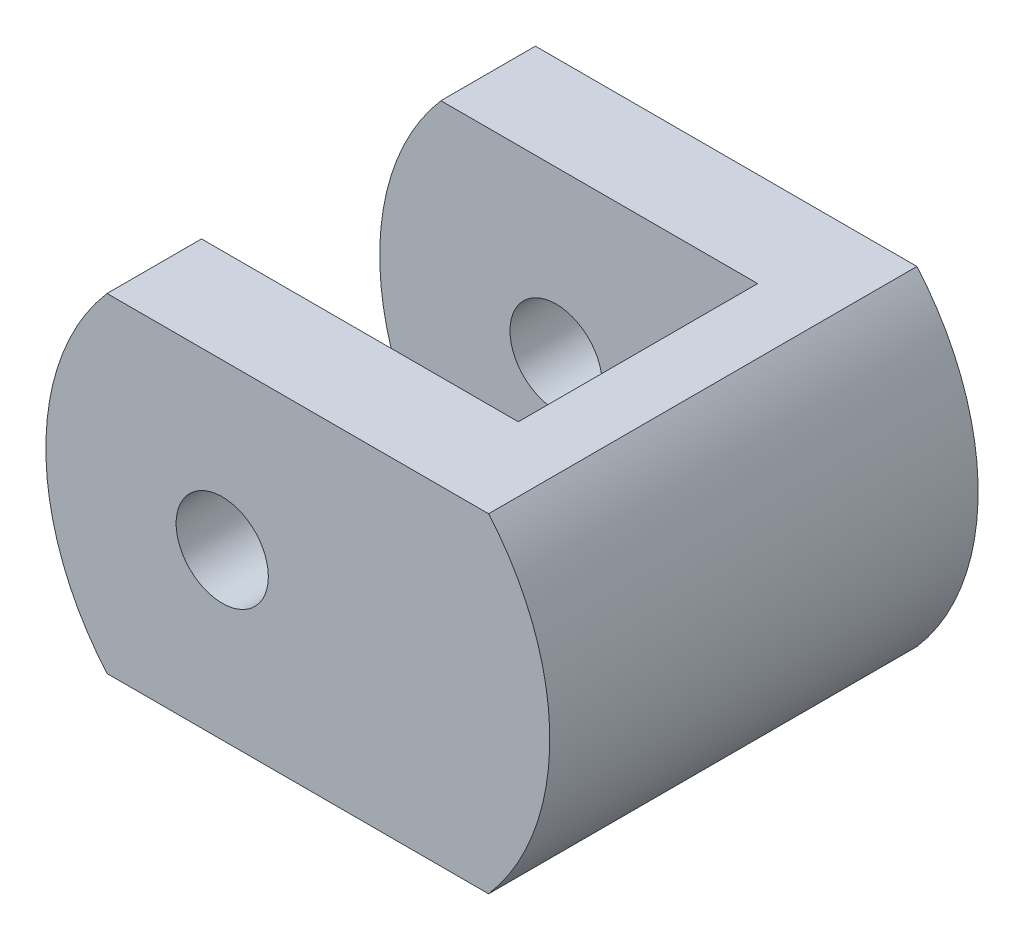
ISO-10303-21;
HEADER;
FILE_DESCRIPTION(('STEP AP214'),'2;1');
FILE_NAME('part.step','',(''),(''),'','','');
FILE_SCHEMA(('AUTOMOTIVE_DESIGN { 1 0 10303 214 1 1 1 1 }'));
ENDSEC;
DATA;
#1=APPLICATION_CONTEXT('core data for automotive mechanical design processes');
#2=APPLICATION_PROTOCOL_DEFINITION('international standard','automotive_design',2000,#1);
#3=PRODUCT_CONTEXT('',#1,'mechanical');
#4=PRODUCT('Part','Part','',(#3));
#5=PRODUCT_RELATED_PRODUCT_CATEGORY('part','',(#4));
#6=PRODUCT_DEFINITION_FORMATION('','',#4);
#7=PRODUCT_DEFINITION_CONTEXT('part definition',#1,'design');
#8=PRODUCT_DEFINITION('design','',#6,#7);
#9=PRODUCT_DEFINITION_SHAPE('','',#8);
#10=(LENGTH_UNIT() NAMED_UNIT(*) SI_UNIT(.MILLI.,.METRE.));
#11=(NAMED_UNIT(*) PLANE_ANGLE_UNIT() SI_UNIT($,.RADIAN.));
#12=(NAMED_UNIT(*) SI_UNIT($,.STERADIAN.) SOLID_ANGLE_UNIT());
#13=UNCERTAINTY_MEASURE_WITH_UNIT(LENGTH_MEASURE(1.E-05),#10,'distance_accuracy_value','');
#14=(GEOMETRIC_REPRESENTATION_CONTEXT(3) GLOBAL_UNCERTAINTY_ASSIGNED_CONTEXT((#13)) GLOBAL_UNIT_ASSIGNED_CONTEXT((#10,
#11,#12)) REPRESENTATION_CONTEXT('',''));
#15=CARTESIAN_POINT('',(0.,0.,0.));
#16=DIRECTION('',(0.,0.,1.));
#17=DIRECTION('',(1.,0.,0.));
#18=AXIS2_PLACEMENT_3D('',#15,#16,#17);
#19=CARTESIAN_POINT('',(0.,0.,10.795));
#20=DIRECTION('',(0.,0.,1.));
#21=DIRECTION('',(1.,0.,0.));
#22=AXIS2_PLACEMENT_3D('',#19,#20,#21);
#23=CYLINDRICAL_SURFACE('',#22,12.7);
#24=DIRECTION('',(0.,0.,1.));
#25=VECTOR('',#24,1.);
#26=CARTESIAN_POINT('',(9.61580905389342,8.29615671495309,-10.795));
#27=LINE('',#26,#25);
#28=CARTESIAN_POINT('',(9.61580905389342,8.29615671495309,-10.795));
#29=VERTEX_POINT('',#28);
#30=CARTESIAN_POINT('',(9.61580905389342,8.29615671495309,10.795));
#31=VERTEX_POINT('',#30);
#32=EDGE_CURVE('E150',#29,#31,#27,.T.);
#33=ORIENTED_EDGE('',*,*,#32,.T.);
#34=CARTESIAN_POINT('',(0.,0.,10.795));
#35=DIRECTION('',(0.,0.,1.));
#36=DIRECTION('',(1.,0.,0.));
#37=AXIS2_PLACEMENT_3D('',#34,#35,#36);
#38=CIRCLE('',#37,12.7);
#39=CARTESIAN_POINT('',(9.61580905389342,-8.29615671495309,10.795));
#40=VERTEX_POINT('',#39);
#41=EDGE_CURVE('E121',#40,#31,#38,.T.);
#42=ORIENTED_EDGE('',*,*,#41,.F.);
#43=DIRECTION('',(0.,0.,1.));
#44=VECTOR('',#43,1.);
#45=CARTESIAN_POINT('',(9.61580905389342,-8.29615671495309,-10.795));
#46=LINE('',#45,#44);
#47=CARTESIAN_POINT('',(9.61580905389342,-8.29615671495309,-10.795));
#48=VERTEX_POINT('',#47);
#49=EDGE_CURVE('E179',#48,#40,#46,.T.);
#50=ORIENTED_EDGE('',*,*,#49,.F.);
#51=CARTESIAN_POINT('',(0.,0.,-10.795));
#52=DIRECTION('',(0.,0.,1.));
#53=DIRECTION('',(1.,0.,0.));
#54=AXIS2_PLACEMENT_3D('',#51,#52,#53);
#55=CIRCLE('',#54,12.7);
#56=EDGE_CURVE('E130',#48,#29,#55,.T.);
#57=ORIENTED_EDGE('',*,*,#56,.T.);
#58=EDGE_LOOP('',(#33,#42,#50,#57));
#59=FACE_BOUND('',#58,.T.);
#60=ADVANCED_FACE('F39',(#59),#23,.T.);
#61=DIRECTION('',(0.,0.,1.));
#62=VECTOR('',#61,1.);
#63=CARTESIAN_POINT('',(-9.61580905389342,8.29615671495309,-10.795));
#64=LINE('',#63,#62);
#65=CARTESIAN_POINT('',(-9.61580905389342,8.29615671495309,-10.795));
#66=VERTEX_POINT('',#65);
#67=CARTESIAN_POINT('',(-9.61580905389342,8.29615671495309,-6.0325));
#68=VERTEX_POINT('',#67);
#69=EDGE_CURVE('E111',#66,#68,#64,.T.);
#70=ORIENTED_EDGE('',*,*,#69,.F.);
#71=CARTESIAN_POINT('',(-9.61580905389342,-8.29615671495309,-10.795));
#72=VERTEX_POINT('',#71);
#73=EDGE_CURVE('E128',#66,#72,#55,.T.);
#74=ORIENTED_EDGE('',*,*,#73,.T.);
#75=DIRECTION('',(0.,0.,1.));
#76=VECTOR('',#75,1.);
#77=CARTESIAN_POINT('',(-9.61580905389342,-8.29615671495309,-10.795));
#78=LINE('',#77,#76);
#79=CARTESIAN_POINT('',(-9.61580905389342,-8.29615671495309,-6.0325));
#80=VERTEX_POINT('',#79);
#81=EDGE_CURVE('E173',#72,#80,#78,.T.);
#82=ORIENTED_EDGE('',*,*,#81,.T.);
#83=CARTESIAN_POINT('',(0.,0.,-6.0325));
#84=DIRECTION('',(0.,0.,-1.));
#85=DIRECTION('',(-1.,0.,0.));
#86=AXIS2_PLACEMENT_3D('',#83,#84,#85);
#87=CIRCLE('',#86,12.7);
#88=EDGE_CURVE('E126',#68,#80,#87,.F.);
#89=ORIENTED_EDGE('',*,*,#88,.F.);
#90=EDGE_LOOP('',(#70,#74,#82,#89));
#91=FACE_BOUND('',#90,.T.);
#92=ADVANCED_FACE('F171',(#91),#23,.T.);
#93=CARTESIAN_POINT('',(-9.61580905389342,8.29615671495309,6.0325));
#94=VERTEX_POINT('',#93);
#95=CARTESIAN_POINT('',(-9.61580905389342,8.29615671495309,10.795));
#96=VERTEX_POINT('',#95);
#97=EDGE_CURVE('E102',#94,#96,#64,.T.);
#98=ORIENTED_EDGE('',*,*,#97,.F.);
#99=CARTESIAN_POINT('',(0.,0.,6.0325));
#100=DIRECTION('',(0.,0.,1.));
#101=DIRECTION('',(1.,0.,0.));
#102=AXIS2_PLACEMENT_3D('',#99,#100,#101);
#103=CIRCLE('',#102,12.7);
#104=CARTESIAN_POINT('',(-9.61580905389342,-8.29615671495309,6.0325));
#105=VERTEX_POINT('',#104);
#106=EDGE_CURVE('E124',#105,#94,#103,.F.);
#107=ORIENTED_EDGE('',*,*,#106,.F.);
#108=CARTESIAN_POINT('',(-9.61580905389342,-8.29615671495309,10.795));
#109=VERTEX_POINT('',#108);
#110=EDGE_CURVE('E55',#105,#109,#78,.T.);
#111=ORIENTED_EDGE('',*,*,#110,.T.);
#112=EDGE_CURVE('E119',#96,#109,#38,.T.);
#113=ORIENTED_EDGE('',*,*,#112,.F.);
#114=EDGE_LOOP('',(#98,#107,#111,#113));
#115=FACE_BOUND('',#114,.T.);
#116=ADVANCED_FACE('F41',(#115),#23,.T.);
#117=CARTESIAN_POINT('',(0.,0.,10.795));
#118=DIRECTION('',(0.,0.,1.));
#119=DIRECTION('',(1.,0.,0.));
#120=AXIS2_PLACEMENT_3D('',#117,#118,#119);
#121=PLANE('',#120);
#122=CARTESIAN_POINT('',(-3.81000000000001,0.,10.795));
#123=DIRECTION('',(0.,0.,1.));
#124=DIRECTION('',(1.,0.,0.));
#125=AXIS2_PLACEMENT_3D('',#122,#123,#124);
#126=CIRCLE('',#125,2.3241);
#127=CARTESIAN_POINT('',(-1.48590000000001,0.,10.795));
#128=VERTEX_POINT('',#127);
#129=EDGE_CURVE('E184',#128,#128,#126,.T.);
#130=ORIENTED_EDGE('',*,*,#129,.F.);
#131=EDGE_LOOP('',(#130));
#132=FACE_BOUND('',#131,.T.);
#133=DIRECTION('',(1.,0.,0.));
#134=VECTOR('',#133,1.);
#135=CARTESIAN_POINT('',(-9.61580905389342,8.29615671495309,10.795));
#136=LINE('',#135,#134);
#137=EDGE_CURVE('E105',#96,#31,#136,.T.);
#138=ORIENTED_EDGE('',*,*,#137,.F.);
#139=ORIENTED_EDGE('',*,*,#112,.T.);
#140=DIRECTION('',(-1.,0.,0.));
#141=VECTOR('',#140,1.);
#142=CARTESIAN_POINT('',(-9.61580905389342,-8.29615671495309,10.795));
#143=LINE('',#142,#141);
#144=EDGE_CURVE('E122',#40,#109,#143,.T.);
#145=ORIENTED_EDGE('',*,*,#144,.F.);
#146=ORIENTED_EDGE('',*,*,#41,.T.);
#147=EDGE_LOOP('',(#138,#139,#145,#146));
#148=FACE_BOUND('',#147,.T.);
#149=ADVANCED_FACE('F117',(#132,#148),#121,.T.);
#150=CARTESIAN_POINT('',(0.,0.,-10.795));
#151=DIRECTION('',(0.,0.,-1.));
#152=DIRECTION('',(-1.,0.,0.));
#153=AXIS2_PLACEMENT_3D('',#150,#151,#152);
#154=PLANE('',#153);
#155=CARTESIAN_POINT('',(-3.81000000000001,0.,-10.795));
#156=DIRECTION('',(0.,0.,1.));
#157=DIRECTION('',(1.,0.,0.));
#158=AXIS2_PLACEMENT_3D('',#155,#156,#157);
#159=CIRCLE('',#158,2.3241);
#160=CARTESIAN_POINT('',(-1.48590000000001,0.,-10.795));
#161=VERTEX_POINT('',#160);
#162=EDGE_CURVE('E190',#161,#161,#159,.T.);
#163=ORIENTED_EDGE('',*,*,#162,.T.);
#164=EDGE_LOOP('',(#163));
#165=FACE_BOUND('',#164,.T.);
#166=DIRECTION('',(1.,0.,0.));
#167=VECTOR('',#166,1.);
#168=CARTESIAN_POINT('',(-9.61580905389342,8.29615671495309,-10.795));
#169=LINE('',#168,#167);
#170=EDGE_CURVE('E112',#66,#29,#169,.T.);
#171=ORIENTED_EDGE('',*,*,#170,.T.);
#172=ORIENTED_EDGE('',*,*,#56,.F.);
#173=DIRECTION('',(-1.,0.,0.));
#174=VECTOR('',#173,1.);
#175=CARTESIAN_POINT('',(-9.61580905389342,-8.29615671495309,-10.795));
#176=LINE('',#175,#174);
#177=EDGE_CURVE('E178',#48,#72,#176,.T.);
#178=ORIENTED_EDGE('',*,*,#177,.T.);
#179=ORIENTED_EDGE('',*,*,#73,.F.);
#180=EDGE_LOOP('',(#171,#172,#178,#179));
#181=FACE_BOUND('',#180,.T.);
#182=ADVANCED_FACE('F177',(#165,#181),#154,.T.);
#183=CARTESIAN_POINT('',(-12.7,-12.7,-6.0325));
#184=DIRECTION('',(0.,0.,-1.));
#185=DIRECTION('',(-1.,0.,0.));
#186=AXIS2_PLACEMENT_3D('',#183,#184,#185);
#187=PLANE('',#186);
#188=CARTESIAN_POINT('',(-3.81000000000001,0.,-6.0325));
#189=DIRECTION('',(0.,0.,-1.));
#190=DIRECTION('',(-1.,0.,0.));
#191=AXIS2_PLACEMENT_3D('',#188,#189,#190);
#192=CIRCLE('',#191,2.3241);
#193=CARTESIAN_POINT('',(-6.13410000000001,0.,-6.0325));
#194=VERTEX_POINT('',#193);
#195=EDGE_CURVE('E187',#194,#194,#192,.T.);
#196=ORIENTED_EDGE('',*,*,#195,.T.);
#197=EDGE_LOOP('',(#196));
#198=FACE_BOUND('',#197,.T.);
#199=DIRECTION('',(0.,1.,0.));
#200=VECTOR('',#199,1.);
#201=CARTESIAN_POINT('',(6.35000000000001,-12.7,-6.0325));
#202=LINE('',#201,#200);
#203=CARTESIAN_POINT('',(6.35000000000001,-8.29615671495309,-6.0325));
#204=VERTEX_POINT('',#203);
#205=CARTESIAN_POINT('',(6.35000000000001,8.29615671495309,-6.0325));
#206=VERTEX_POINT('',#205);
#207=EDGE_CURVE('E148',#204,#206,#202,.T.);
#208=ORIENTED_EDGE('',*,*,#207,.T.);
#209=DIRECTION('',(-1.,0.,0.));
#210=VECTOR('',#209,1.);
#211=CARTESIAN_POINT('',(-12.7,8.29615671495309,-6.0325));
#212=LINE('',#211,#210);
#213=EDGE_CURVE('E158',#206,#68,#212,.T.);
#214=ORIENTED_EDGE('',*,*,#213,.T.);
#215=ORIENTED_EDGE('',*,*,#88,.T.);
#216=DIRECTION('',(1.,0.,0.));
#217=VECTOR('',#216,1.);
#218=CARTESIAN_POINT('',(-12.7,-8.29615671495309,-6.0325));
#219=LINE('',#218,#217);
#220=EDGE_CURVE('E149',#80,#204,#219,.T.);
#221=ORIENTED_EDGE('',*,*,#220,.T.);
#222=EDGE_LOOP('',(#208,#214,#215,#221));
#223=FACE_BOUND('',#222,.T.);
#224=ADVANCED_FACE('F223',(#198,#223),#187,.F.);
#225=CARTESIAN_POINT('',(6.35000000000001,-12.7,6.0325));
#226=DIRECTION('',(1.,0.,0.));
#227=DIRECTION('',(0.,0.,-1.));
#228=AXIS2_PLACEMENT_3D('',#225,#226,#227);
#229=PLANE('',#228);
#230=DIRECTION('',(0.,1.,0.));
#231=VECTOR('',#230,1.);
#232=CARTESIAN_POINT('',(6.35000000000001,-12.7,6.0325));
#233=LINE('',#232,#231);
#234=CARTESIAN_POINT('',(6.35,-8.29615671495309,6.0325));
#235=VERTEX_POINT('',#234);
#236=CARTESIAN_POINT('',(6.35000000000001,8.29615671495309,6.0325));
#237=VERTEX_POINT('',#236);
#238=EDGE_CURVE('E139',#235,#237,#233,.T.);
#239=ORIENTED_EDGE('',*,*,#238,.T.);
#240=DIRECTION('',(0.,0.,-1.));
#241=VECTOR('',#240,1.);
#242=CARTESIAN_POINT('',(6.35000000000001,8.29615671495309,6.0325));
#243=LINE('',#242,#241);
#244=EDGE_CURVE('E63',#237,#206,#243,.T.);
#245=ORIENTED_EDGE('',*,*,#244,.T.);
#246=ORIENTED_EDGE('',*,*,#207,.F.);
#247=DIRECTION('',(0.,0.,1.));
#248=VECTOR('',#247,1.);
#249=CARTESIAN_POINT('',(6.35000000000001,-8.29615671495309,6.0325));
#250=LINE('',#249,#248);
#251=EDGE_CURVE('E142',#204,#235,#250,.T.);
#252=ORIENTED_EDGE('',*,*,#251,.T.);
#253=EDGE_LOOP('',(#239,#245,#246,#252));
#254=FACE_BOUND('',#253,.T.);
#255=ADVANCED_FACE('F146',(#254),#229,.F.);
#256=CARTESIAN_POINT('',(-12.7,-12.7,6.0325));
#257=DIRECTION('',(0.,0.,1.));
#258=DIRECTION('',(1.,0.,0.));
#259=AXIS2_PLACEMENT_3D('',#256,#257,#258);
#260=PLANE('',#259);
#261=CARTESIAN_POINT('',(-3.81000000000001,0.,6.0325));
#262=DIRECTION('',(0.,0.,1.));
#263=DIRECTION('',(1.,0.,0.));
#264=AXIS2_PLACEMENT_3D('',#261,#262,#263);
#265=CIRCLE('',#264,2.3241);
#266=CARTESIAN_POINT('',(-1.48590000000001,0.,6.0325));
#267=VERTEX_POINT('',#266);
#268=EDGE_CURVE('E43',#267,#267,#265,.T.);
#269=ORIENTED_EDGE('',*,*,#268,.T.);
#270=EDGE_LOOP('',(#269));
#271=FACE_BOUND('',#270,.T.);
#272=ORIENTED_EDGE('',*,*,#106,.T.);
#273=DIRECTION('',(1.,0.,0.));
#274=VECTOR('',#273,1.);
#275=CARTESIAN_POINT('',(-12.7,8.29615671495309,6.0325));
#276=LINE('',#275,#274);
#277=EDGE_CURVE('E11',#94,#237,#276,.T.);
#278=ORIENTED_EDGE('',*,*,#277,.T.);
#279=ORIENTED_EDGE('',*,*,#238,.F.);
#280=DIRECTION('',(-1.,0.,0.));
#281=VECTOR('',#280,1.);
#282=CARTESIAN_POINT('',(-12.7,-8.29615671495309,6.0325));
#283=LINE('',#282,#281);
#284=EDGE_CURVE('E48',#235,#105,#283,.T.);
#285=ORIENTED_EDGE('',*,*,#284,.T.);
#286=EDGE_LOOP('',(#272,#278,#279,#285));
#287=FACE_BOUND('',#286,.T.);
#288=ADVANCED_FACE('F137',(#271,#287),#260,.F.);
#289=CARTESIAN_POINT('',(-9.61580905389342,-8.29615671495309,-10.795));
#290=DIRECTION('',(0.,1.,0.));
#291=DIRECTION('',(0.,0.,1.));
#292=AXIS2_PLACEMENT_3D('',#289,#290,#291);
#293=PLANE('',#292);
#294=ORIENTED_EDGE('',*,*,#81,.F.);
#295=ORIENTED_EDGE('',*,*,#177,.F.);
#296=ORIENTED_EDGE('',*,*,#49,.T.);
#297=ORIENTED_EDGE('',*,*,#144,.T.);
#298=ORIENTED_EDGE('',*,*,#110,.F.);
#299=ORIENTED_EDGE('',*,*,#284,.F.);
#300=ORIENTED_EDGE('',*,*,#251,.F.);
#301=ORIENTED_EDGE('',*,*,#220,.F.);
#302=EDGE_LOOP('',(#294,#295,#296,#297,#298,#299,#300,#301));
#303=FACE_BOUND('',#302,.T.);
#304=ADVANCED_FACE('F141',(#303),#293,.F.);
#305=CARTESIAN_POINT('',(-9.61580905389342,8.29615671495309,-10.795));
#306=DIRECTION('',(0.,-1.,0.));
#307=DIRECTION('',(0.,0.,-1.));
#308=AXIS2_PLACEMENT_3D('',#305,#306,#307);
#309=PLANE('',#308);
#310=ORIENTED_EDGE('',*,*,#244,.F.);
#311=ORIENTED_EDGE('',*,*,#277,.F.);
#312=ORIENTED_EDGE('',*,*,#97,.T.);
#313=ORIENTED_EDGE('',*,*,#137,.T.);
#314=ORIENTED_EDGE('',*,*,#32,.F.);
#315=ORIENTED_EDGE('',*,*,#170,.F.);
#316=ORIENTED_EDGE('',*,*,#69,.T.);
#317=ORIENTED_EDGE('',*,*,#213,.F.);
#318=EDGE_LOOP('',(#310,#311,#312,#313,#314,#315,#316,#317));
#319=FACE_BOUND('',#318,.T.);
#320=ADVANCED_FACE('F104',(#319),#309,.F.);
#321=CARTESIAN_POINT('',(-3.81000000000001,0.,-10.795));
#322=DIRECTION('',(0.,0.,1.));
#323=DIRECTION('',(1.,0.,0.));
#324=AXIS2_PLACEMENT_3D('',#321,#322,#323);
#325=CYLINDRICAL_SURFACE('',#324,2.3241);
#326=ORIENTED_EDGE('',*,*,#129,.T.);
#327=EDGE_LOOP('',(#326));
#328=FACE_BOUND('',#327,.T.);
#329=ORIENTED_EDGE('',*,*,#268,.F.);
#330=EDGE_LOOP('',(#329));
#331=FACE_BOUND('',#330,.T.);
#332=ADVANCED_FACE('F198',(#328,#331),#325,.F.);
#333=ORIENTED_EDGE('',*,*,#162,.F.);
#334=EDGE_LOOP('',(#333));
#335=FACE_BOUND('',#334,.T.);
#336=ORIENTED_EDGE('',*,*,#195,.F.);
#337=EDGE_LOOP('',(#336));
#338=FACE_BOUND('',#337,.T.);
#339=ADVANCED_FACE('F200',(#335,#338),#325,.F.);
#340=CLOSED_SHELL('',(#60,#92,#116,#149,#182,#224,#255,#288,#304,#320,#332,#339));
#341=MANIFOLD_SOLID_BREP('B2',#340);
#342=ADVANCED_BREP_SHAPE_REPRESENTATION('',(#18,#341),#14);
#343=SHAPE_DEFINITION_REPRESENTATION(#9,#342);
ENDSEC;
END-ISO-10303-21;
